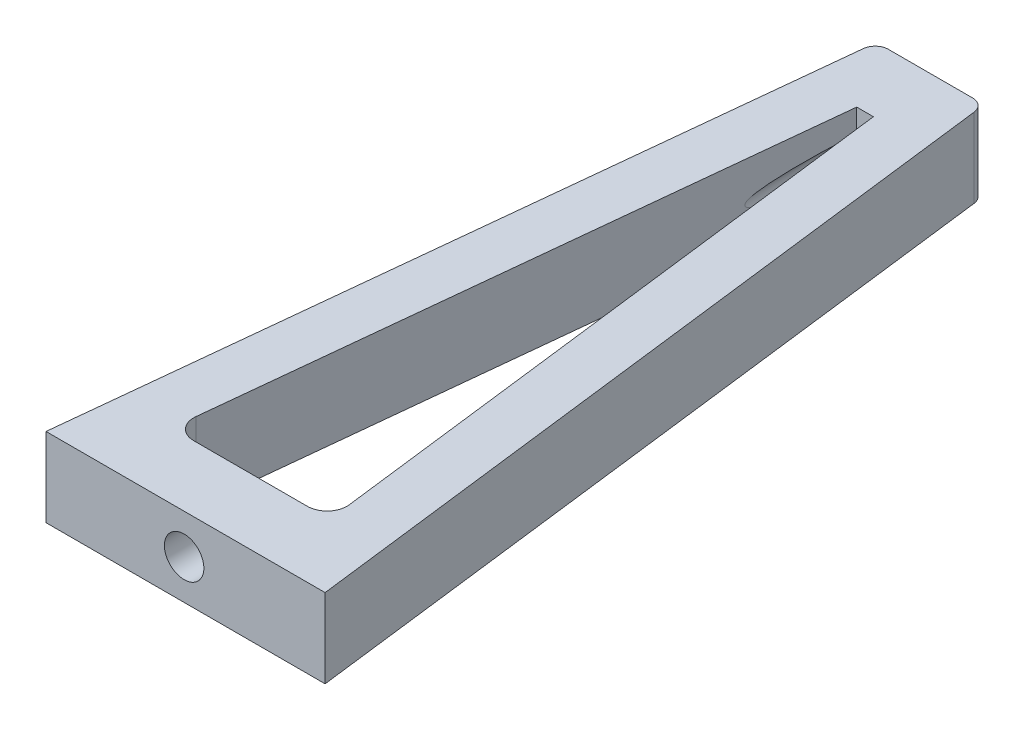
ISO-10303-21;
HEADER;
FILE_DESCRIPTION(('STEP AP214'),'2;1');
FILE_NAME('part.step','',(''),(''),'','','');
FILE_SCHEMA(('AUTOMOTIVE_DESIGN { 1 0 10303 214 1 1 1 1 }'));
ENDSEC;
DATA;
#1=APPLICATION_CONTEXT('core data for automotive mechanical design processes');
#2=APPLICATION_PROTOCOL_DEFINITION('international standard','automotive_design',2000,#1);
#3=PRODUCT_CONTEXT('',#1,'mechanical');
#4=PRODUCT('Part','Part','',(#3));
#5=PRODUCT_RELATED_PRODUCT_CATEGORY('part','',(#4));
#6=PRODUCT_DEFINITION_FORMATION('','',#4);
#7=PRODUCT_DEFINITION_CONTEXT('part definition',#1,'design');
#8=PRODUCT_DEFINITION('design','',#6,#7);
#9=PRODUCT_DEFINITION_SHAPE('','',#8);
#10=(LENGTH_UNIT() NAMED_UNIT(*) SI_UNIT(.MILLI.,.METRE.));
#11=(NAMED_UNIT(*) PLANE_ANGLE_UNIT() SI_UNIT($,.RADIAN.));
#12=(NAMED_UNIT(*) SI_UNIT($,.STERADIAN.) SOLID_ANGLE_UNIT());
#13=UNCERTAINTY_MEASURE_WITH_UNIT(LENGTH_MEASURE(1.E-05),#10,'distance_accuracy_value','');
#14=(GEOMETRIC_REPRESENTATION_CONTEXT(3) GLOBAL_UNCERTAINTY_ASSIGNED_CONTEXT((#13)) GLOBAL_UNIT_ASSIGNED_CONTEXT((#10,
#11,#12)) REPRESENTATION_CONTEXT('',''));
#15=CARTESIAN_POINT('',(0.,0.,0.));
#16=DIRECTION('',(0.,0.,1.));
#17=DIRECTION('',(1.,0.,0.));
#18=AXIS2_PLACEMENT_3D('',#15,#16,#17);
#19=CARTESIAN_POINT('',(9.67471825234836,6.,-42.1036060842594));
#20=DIRECTION('',(0.,0.,1.));
#21=DIRECTION('',(1.,0.,0.));
#22=AXIS2_PLACEMENT_3D('',#19,#20,#21);
#23=PLANE('',#22);
#24=CARTESIAN_POINT('',(9.00538159110922,3.,-42.1036060842594));
#25=DIRECTION('',(0.,0.,1.));
#26=DIRECTION('',(1.,0.,0.));
#27=AXIS2_PLACEMENT_3D('',#24,#25,#26);
#28=CIRCLE('',#27,1.4);
#29=CARTESIAN_POINT('',(9.67471825234836,4.22962938884903,-42.1036060842594));
#30=VERTEX_POINT('',#29);
#31=CARTESIAN_POINT('',(8.40743513778158,4.26588310635417,-42.1036060842594));
#32=VERTEX_POINT('',#31);
#33=EDGE_CURVE('E49',#30,#32,#28,.T.);
#34=ORIENTED_EDGE('',*,*,#33,.F.);
#35=DIRECTION('',(0.,-1.,0.));
#36=VECTOR('',#35,1.);
#37=CARTESIAN_POINT('',(9.67471825234836,6.,-42.1036060842594));
#38=LINE('',#37,#36);
#39=CARTESIAN_POINT('',(9.67471825234836,6.,-42.1036060842594));
#40=VERTEX_POINT('',#39);
#41=EDGE_CURVE('E160',#40,#30,#38,.T.);
#42=ORIENTED_EDGE('',*,*,#41,.F.);
#43=DIRECTION('',(-1.,0.,0.));
#44=VECTOR('',#43,1.);
#45=CARTESIAN_POINT('',(9.67471825234836,6.,-42.1036060842594));
#46=LINE('',#45,#44);
#47=CARTESIAN_POINT('',(8.40743513778158,6.,-42.1036060842594));
#48=VERTEX_POINT('',#47);
#49=EDGE_CURVE('E302',#40,#48,#46,.T.);
#50=ORIENTED_EDGE('',*,*,#49,.T.);
#51=DIRECTION('',(0.,-1.,0.));
#52=VECTOR('',#51,1.);
#53=CARTESIAN_POINT('',(8.40743513778158,6.,-42.1036060842594));
#54=LINE('',#53,#52);
#55=EDGE_CURVE('E154',#48,#32,#54,.T.);
#56=ORIENTED_EDGE('',*,*,#55,.T.);
#57=EDGE_LOOP('',(#34,#42,#50,#56));
#58=FACE_BOUND('',#57,.T.);
#59=ADVANCED_FACE('F34',(#58),#23,.T.);
#60=CARTESIAN_POINT('',(12.2028935057736,6.,-46.1036060842595));
#61=DIRECTION('',(0.,-1.,0.));
#62=DIRECTION('',(0.,0.,-1.));
#63=AXIS2_PLACEMENT_3D('',#60,#61,#62);
#64=PLANE('',#63);
#65=CARTESIAN_POINT('',(12.2028935057736,6.,-46.1036060842595));
#66=DIRECTION('',(0.,1.,0.));
#67=DIRECTION('',(0.,0.,-1.));
#68=AXIS2_PLACEMENT_3D('',#65,#66,#67);
#69=CIRCLE('',#68,1.);
#70=CARTESIAN_POINT('',(13.195333016172,6.,-46.2263408315818));
#71=VERTEX_POINT('',#70);
#72=CARTESIAN_POINT('',(12.2028935057736,6.,-47.1036060842595));
#73=VERTEX_POINT('',#72);
#74=EDGE_CURVE('E167',#71,#73,#69,.T.);
#75=ORIENTED_EDGE('',*,*,#74,.T.);
#76=DIRECTION('',(-1.,0.,0.));
#77=VECTOR('',#76,1.);
#78=CARTESIAN_POINT('',(5.80786967644483,6.,-47.1036060842595));
#79=LINE('',#78,#77);
#80=CARTESIAN_POINT('',(5.80786967644483,6.,-47.1036060842595));
#81=VERTEX_POINT('',#80);
#82=EDGE_CURVE('E170',#73,#81,#79,.T.);
#83=ORIENTED_EDGE('',*,*,#82,.T.);
#84=CARTESIAN_POINT('',(5.80786967644483,6.,-46.1036060842595));
#85=DIRECTION('',(0.,1.,0.));
#86=DIRECTION('',(0.,0.,1.));
#87=AXIS2_PLACEMENT_3D('',#84,#85,#86);
#88=CIRCLE('',#87,1.);
#89=CARTESIAN_POINT('',(4.81325126755405,6.,-46.2072121685189));
#90=VERTEX_POINT('',#89);
#91=EDGE_CURVE('E173',#81,#90,#88,.T.);
#92=ORIENTED_EDGE('',*,*,#91,.T.);
#93=DIRECTION('',(-0.103606084259456,0.,0.994618408890778));
#94=VECTOR('',#93,1.);
#95=CARTESIAN_POINT('',(4.81325126755405,6.,-46.2072121685189));
#96=LINE('',#95,#94);
#97=CARTESIAN_POINT('',(-1.04166666666667,6.,10.));
#98=VERTEX_POINT('',#97);
#99=EDGE_CURVE('E175',#90,#98,#96,.T.);
#100=ORIENTED_EDGE('',*,*,#99,.T.);
#101=DIRECTION('',(1.,0.,0.));
#102=VECTOR('',#101,1.);
#103=CARTESIAN_POINT('',(20.1488305971527,6.,10.));
#104=LINE('',#103,#102);
#105=CARTESIAN_POINT('',(20.1488305971527,6.,10.));
#106=VERTEX_POINT('',#105);
#107=EDGE_CURVE('E177',#98,#106,#104,.T.);
#108=ORIENTED_EDGE('',*,*,#107,.T.);
#109=DIRECTION('',(-0.122734747322353,0.,-0.992439510398351));
#110=VECTOR('',#109,1.);
#111=CARTESIAN_POINT('',(13.195333016172,6.,-46.2263408315818));
#112=LINE('',#111,#110);
#113=EDGE_CURVE('E179',#106,#71,#112,.T.);
#114=ORIENTED_EDGE('',*,*,#113,.T.);
#115=EDGE_LOOP('',(#75,#83,#92,#100,#108,#114));
#116=FACE_BOUND('',#115,.T.);
#117=CARTESIAN_POINT('',(13.8030777410744,6.,3.5));
#118=DIRECTION('',(0.,1.,0.));
#119=DIRECTION('',(0.,0.,1.));
#120=AXIS2_PLACEMENT_3D('',#117,#118,#119);
#121=CIRCLE('',#120,1.5);
#122=CARTESIAN_POINT('',(13.8030777410744,6.,5.));
#123=VERTEX_POINT('',#122);
#124=CARTESIAN_POINT('',(15.291737006672,6.,3.31589787901646));
#125=VERTEX_POINT('',#124);
#126=EDGE_CURVE('E297',#123,#125,#121,.T.);
#127=ORIENTED_EDGE('',*,*,#126,.F.);
#128=DIRECTION('',(1.,0.,0.));
#129=VECTOR('',#128,1.);
#130=CARTESIAN_POINT('',(5.16517556800627,6.,5.));
#131=LINE('',#130,#129);
#132=CARTESIAN_POINT('',(5.16517556800627,6.,5.));
#133=VERTEX_POINT('',#132);
#134=EDGE_CURVE('E308',#133,#123,#131,.T.);
#135=ORIENTED_EDGE('',*,*,#134,.F.);
#136=CARTESIAN_POINT('',(5.16517556800626,6.,3.5));
#137=DIRECTION('',(0.,1.,0.));
#138=DIRECTION('',(0.,0.,1.));
#139=AXIS2_PLACEMENT_3D('',#136,#137,#138);
#140=CIRCLE('',#139,1.5);
#141=CARTESIAN_POINT('',(3.67324795467009,6.,3.3445908736108));
#142=VERTEX_POINT('',#141);
#143=EDGE_CURVE('E306',#142,#133,#140,.T.);
#144=ORIENTED_EDGE('',*,*,#143,.F.);
#145=DIRECTION('',(-0.103606084259456,0.,0.994618408890778));
#146=VECTOR('',#145,1.);
#147=CARTESIAN_POINT('',(8.40743513778158,6.,-42.1036060842594));
#148=LINE('',#147,#146);
#149=EDGE_CURVE('E304',#48,#142,#148,.T.);
#150=ORIENTED_EDGE('',*,*,#149,.F.);
#151=ORIENTED_EDGE('',*,*,#49,.F.);
#152=DIRECTION('',(-0.122734747322353,0.,-0.992439510398351));
#153=VECTOR('',#152,1.);
#154=CARTESIAN_POINT('',(9.67471825234836,6.,-42.1036060842594));
#155=LINE('',#154,#153);
#156=EDGE_CURVE('E299',#125,#40,#155,.T.);
#157=ORIENTED_EDGE('',*,*,#156,.F.);
#158=EDGE_LOOP('',(#127,#135,#144,#150,#151,#157));
#159=FACE_BOUND('',#158,.T.);
#160=ADVANCED_FACE('F233',(#116,#159),#64,.F.);
#161=CARTESIAN_POINT('',(12.2028935057736,0.,-46.1036060842595));
#162=DIRECTION('',(0.,-1.,0.));
#163=DIRECTION('',(0.,0.,-1.));
#164=AXIS2_PLACEMENT_3D('',#161,#162,#163);
#165=PLANE('',#164);
#166=CARTESIAN_POINT('',(12.2028935057736,0.,-46.1036060842595));
#167=DIRECTION('',(0.,1.,0.));
#168=DIRECTION('',(0.,0.,-1.));
#169=AXIS2_PLACEMENT_3D('',#166,#167,#168);
#170=CIRCLE('',#169,1.);
#171=CARTESIAN_POINT('',(13.195333016172,0.,-46.2263408315818));
#172=VERTEX_POINT('',#171);
#173=CARTESIAN_POINT('',(12.2028935057736,0.,-47.1036060842595));
#174=VERTEX_POINT('',#173);
#175=EDGE_CURVE('E166',#172,#174,#170,.T.);
#176=ORIENTED_EDGE('',*,*,#175,.F.);
#177=DIRECTION('',(-0.122734747322353,0.,-0.992439510398351));
#178=VECTOR('',#177,1.);
#179=CARTESIAN_POINT('',(13.195333016172,0.,-46.2263408315818));
#180=LINE('',#179,#178);
#181=CARTESIAN_POINT('',(20.1488305971527,0.,10.));
#182=VERTEX_POINT('',#181);
#183=EDGE_CURVE('E171',#182,#172,#180,.T.);
#184=ORIENTED_EDGE('',*,*,#183,.F.);
#185=DIRECTION('',(1.,0.,0.));
#186=VECTOR('',#185,1.);
#187=CARTESIAN_POINT('',(20.1488305971527,0.,10.));
#188=LINE('',#187,#186);
#189=CARTESIAN_POINT('',(-1.04166666666667,0.,10.));
#190=VERTEX_POINT('',#189);
#191=EDGE_CURVE('E190',#190,#182,#188,.T.);
#192=ORIENTED_EDGE('',*,*,#191,.F.);
#193=DIRECTION('',(-0.103606084259456,0.,0.994618408890778));
#194=VECTOR('',#193,1.);
#195=CARTESIAN_POINT('',(4.81325126755405,0.,-46.2072121685189));
#196=LINE('',#195,#194);
#197=CARTESIAN_POINT('',(4.81325126755405,0.,-46.2072121685189));
#198=VERTEX_POINT('',#197);
#199=EDGE_CURVE('E188',#198,#190,#196,.T.);
#200=ORIENTED_EDGE('',*,*,#199,.F.);
#201=CARTESIAN_POINT('',(5.80786967644483,0.,-46.1036060842595));
#202=DIRECTION('',(0.,1.,0.));
#203=DIRECTION('',(0.,0.,1.));
#204=AXIS2_PLACEMENT_3D('',#201,#202,#203);
#205=CIRCLE('',#204,1.);
#206=CARTESIAN_POINT('',(5.80786967644483,0.,-47.1036060842595));
#207=VERTEX_POINT('',#206);
#208=EDGE_CURVE('E186',#207,#198,#205,.T.);
#209=ORIENTED_EDGE('',*,*,#208,.F.);
#210=DIRECTION('',(-1.,0.,0.));
#211=VECTOR('',#210,1.);
#212=CARTESIAN_POINT('',(5.80786967644483,0.,-47.1036060842595));
#213=LINE('',#212,#211);
#214=EDGE_CURVE('E184',#174,#207,#213,.T.);
#215=ORIENTED_EDGE('',*,*,#214,.F.);
#216=EDGE_LOOP('',(#176,#184,#192,#200,#209,#215));
#217=FACE_BOUND('',#216,.T.);
#218=DIRECTION('',(1.,0.,0.));
#219=VECTOR('',#218,1.);
#220=CARTESIAN_POINT('',(5.16517556800627,0.,5.));
#221=LINE('',#220,#219);
#222=CARTESIAN_POINT('',(5.16517556800627,0.,5.));
#223=VERTEX_POINT('',#222);
#224=CARTESIAN_POINT('',(13.8030777410744,0.,5.));
#225=VERTEX_POINT('',#224);
#226=EDGE_CURVE('E300',#223,#225,#221,.T.);
#227=ORIENTED_EDGE('',*,*,#226,.T.);
#228=CARTESIAN_POINT('',(13.8030777410744,0.,3.5));
#229=DIRECTION('',(0.,1.,0.));
#230=DIRECTION('',(0.,0.,1.));
#231=AXIS2_PLACEMENT_3D('',#228,#229,#230);
#232=CIRCLE('',#231,1.5);
#233=CARTESIAN_POINT('',(15.291737006672,0.,3.31589787901646));
#234=VERTEX_POINT('',#233);
#235=EDGE_CURVE('E296',#225,#234,#232,.T.);
#236=ORIENTED_EDGE('',*,*,#235,.T.);
#237=DIRECTION('',(-0.122734747322353,0.,-0.992439510398351));
#238=VECTOR('',#237,1.);
#239=CARTESIAN_POINT('',(9.67471825234836,0.,-42.1036060842594));
#240=LINE('',#239,#238);
#241=CARTESIAN_POINT('',(9.67471825234836,0.,-42.1036060842594));
#242=VERTEX_POINT('',#241);
#243=EDGE_CURVE('E313',#234,#242,#240,.T.);
#244=ORIENTED_EDGE('',*,*,#243,.T.);
#245=DIRECTION('',(-1.,0.,0.));
#246=VECTOR('',#245,1.);
#247=CARTESIAN_POINT('',(9.67471825234836,0.,-42.1036060842594));
#248=LINE('',#247,#246);
#249=CARTESIAN_POINT('',(8.40743513778158,0.,-42.1036060842594));
#250=VERTEX_POINT('',#249);
#251=EDGE_CURVE('E316',#242,#250,#248,.T.);
#252=ORIENTED_EDGE('',*,*,#251,.T.);
#253=DIRECTION('',(-0.103606084259456,0.,0.994618408890778));
#254=VECTOR('',#253,1.);
#255=CARTESIAN_POINT('',(8.40743513778158,0.,-42.1036060842594));
#256=LINE('',#255,#254);
#257=CARTESIAN_POINT('',(3.67324795467009,0.,3.3445908736108));
#258=VERTEX_POINT('',#257);
#259=EDGE_CURVE('E152',#250,#258,#256,.T.);
#260=ORIENTED_EDGE('',*,*,#259,.T.);
#261=CARTESIAN_POINT('',(5.16517556800626,0.,3.5));
#262=DIRECTION('',(0.,1.,0.));
#263=DIRECTION('',(0.,0.,1.));
#264=AXIS2_PLACEMENT_3D('',#261,#262,#263);
#265=CIRCLE('',#264,1.5);
#266=EDGE_CURVE('E319',#258,#223,#265,.T.);
#267=ORIENTED_EDGE('',*,*,#266,.T.);
#268=EDGE_LOOP('',(#227,#236,#244,#252,#260,#267));
#269=FACE_BOUND('',#268,.T.);
#270=ADVANCED_FACE('F218',(#217,#269),#165,.T.);
#271=CARTESIAN_POINT('',(12.2028935057736,6.,-46.1036060842595));
#272=DIRECTION('',(0.,-1.,0.));
#273=DIRECTION('',(0.,0.,-1.));
#274=AXIS2_PLACEMENT_3D('',#271,#272,#273);
#275=CYLINDRICAL_SURFACE('',#274,1.);
#276=ORIENTED_EDGE('',*,*,#175,.T.);
#277=DIRECTION('',(0.,-1.,0.));
#278=VECTOR('',#277,1.);
#279=CARTESIAN_POINT('',(12.2028935057736,6.,-47.1036060842595));
#280=LINE('',#279,#278);
#281=EDGE_CURVE('E43',#73,#174,#280,.T.);
#282=ORIENTED_EDGE('',*,*,#281,.F.);
#283=ORIENTED_EDGE('',*,*,#74,.F.);
#284=DIRECTION('',(0.,-1.,0.));
#285=VECTOR('',#284,1.);
#286=CARTESIAN_POINT('',(13.195333016172,6.,-46.2263408315818));
#287=LINE('',#286,#285);
#288=EDGE_CURVE('E181',#71,#172,#287,.T.);
#289=ORIENTED_EDGE('',*,*,#288,.T.);
#290=EDGE_LOOP('',(#276,#282,#283,#289));
#291=FACE_BOUND('',#290,.T.);
#292=ADVANCED_FACE('F36',(#291),#275,.T.);
#293=CARTESIAN_POINT('',(5.80786967644483,6.,-47.1036060842595));
#294=DIRECTION('',(0.,0.,1.));
#295=DIRECTION('',(1.,0.,0.));
#296=AXIS2_PLACEMENT_3D('',#293,#294,#295);
#297=PLANE('',#296);
#298=CARTESIAN_POINT('',(9.00538159110922,3.,-47.1036060842595));
#299=DIRECTION('',(0.,0.,-1.));
#300=DIRECTION('',(-1.,0.,0.));
#301=AXIS2_PLACEMENT_3D('',#298,#299,#300);
#302=CIRCLE('',#301,1.4);
#303=CARTESIAN_POINT('',(7.60538159110922,3.,-47.1036060842595));
#304=VERTEX_POINT('',#303);
#305=EDGE_CURVE('E148',#304,#304,#302,.T.);
#306=ORIENTED_EDGE('',*,*,#305,.F.);
#307=EDGE_LOOP('',(#306));
#308=FACE_BOUND('',#307,.T.);
#309=ORIENTED_EDGE('',*,*,#214,.T.);
#310=DIRECTION('',(0.,-1.,0.));
#311=VECTOR('',#310,1.);
#312=CARTESIAN_POINT('',(5.80786967644483,6.,-47.1036060842595));
#313=LINE('',#312,#311);
#314=EDGE_CURVE('E204',#81,#207,#313,.T.);
#315=ORIENTED_EDGE('',*,*,#314,.F.);
#316=ORIENTED_EDGE('',*,*,#82,.F.);
#317=ORIENTED_EDGE('',*,*,#281,.T.);
#318=EDGE_LOOP('',(#309,#315,#316,#317));
#319=FACE_BOUND('',#318,.T.);
#320=ADVANCED_FACE('F210',(#308,#319),#297,.F.);
#321=CARTESIAN_POINT('',(5.80786967644483,6.,-46.1036060842595));
#322=DIRECTION('',(0.,-1.,0.));
#323=DIRECTION('',(0.,0.,-1.));
#324=AXIS2_PLACEMENT_3D('',#321,#322,#323);
#325=CYLINDRICAL_SURFACE('',#324,1.);
#326=ORIENTED_EDGE('',*,*,#208,.T.);
#327=DIRECTION('',(0.,-1.,0.));
#328=VECTOR('',#327,1.);
#329=CARTESIAN_POINT('',(4.81325126755405,6.,-46.2072121685189));
#330=LINE('',#329,#328);
#331=EDGE_CURVE('E201',#90,#198,#330,.T.);
#332=ORIENTED_EDGE('',*,*,#331,.F.);
#333=ORIENTED_EDGE('',*,*,#91,.F.);
#334=ORIENTED_EDGE('',*,*,#314,.T.);
#335=EDGE_LOOP('',(#326,#332,#333,#334));
#336=FACE_BOUND('',#335,.T.);
#337=ADVANCED_FACE('F225',(#336),#325,.T.);
#338=CARTESIAN_POINT('',(4.81325126755405,6.,-46.2072121685189));
#339=DIRECTION('',(0.994618408890778,0.,0.103606084259456));
#340=DIRECTION('',(0.103606084259456,0.,-0.994618408890778));
#341=AXIS2_PLACEMENT_3D('',#338,#339,#340);
#342=PLANE('',#341);
#343=ORIENTED_EDGE('',*,*,#199,.T.);
#344=DIRECTION('',(0.,-1.,0.));
#345=VECTOR('',#344,1.);
#346=CARTESIAN_POINT('',(-1.04166666666667,6.,10.));
#347=LINE('',#346,#345);
#348=EDGE_CURVE('E198',#98,#190,#347,.T.);
#349=ORIENTED_EDGE('',*,*,#348,.F.);
#350=ORIENTED_EDGE('',*,*,#99,.F.);
#351=ORIENTED_EDGE('',*,*,#331,.T.);
#352=EDGE_LOOP('',(#343,#349,#350,#351));
#353=FACE_BOUND('',#352,.T.);
#354=ADVANCED_FACE('F229',(#353),#342,.F.);
#355=CARTESIAN_POINT('',(20.1488305971527,6.,10.));
#356=DIRECTION('',(0.,0.,-1.));
#357=DIRECTION('',(-1.,0.,0.));
#358=AXIS2_PLACEMENT_3D('',#355,#356,#357);
#359=PLANE('',#358);
#360=CARTESIAN_POINT('',(9.44521131199942,3.,10.));
#361=DIRECTION('',(0.,0.,-1.));
#362=DIRECTION('',(-1.,0.,0.));
#363=AXIS2_PLACEMENT_3D('',#360,#361,#362);
#364=CIRCLE('',#363,1.5);
#365=CARTESIAN_POINT('',(7.94521131199943,3.,10.));
#366=VERTEX_POINT('',#365);
#367=EDGE_CURVE('E289',#366,#366,#364,.F.);
#368=ORIENTED_EDGE('',*,*,#367,.F.);
#369=EDGE_LOOP('',(#368));
#370=FACE_BOUND('',#369,.T.);
#371=ORIENTED_EDGE('',*,*,#191,.T.);
#372=DIRECTION('',(0.,-1.,0.));
#373=VECTOR('',#372,1.);
#374=CARTESIAN_POINT('',(20.1488305971527,6.,10.));
#375=LINE('',#374,#373);
#376=EDGE_CURVE('E195',#106,#182,#375,.T.);
#377=ORIENTED_EDGE('',*,*,#376,.F.);
#378=ORIENTED_EDGE('',*,*,#107,.F.);
#379=ORIENTED_EDGE('',*,*,#348,.T.);
#380=EDGE_LOOP('',(#371,#377,#378,#379));
#381=FACE_BOUND('',#380,.T.);
#382=ADVANCED_FACE('F240',(#370,#381),#359,.F.);
#383=CARTESIAN_POINT('',(13.195333016172,6.,-46.2263408315818));
#384=DIRECTION('',(-0.992439510398351,0.,0.122734747322353));
#385=DIRECTION('',(0.122734747322353,0.,0.992439510398351));
#386=AXIS2_PLACEMENT_3D('',#383,#384,#385);
#387=PLANE('',#386);
#388=ORIENTED_EDGE('',*,*,#183,.T.);
#389=ORIENTED_EDGE('',*,*,#288,.F.);
#390=ORIENTED_EDGE('',*,*,#113,.F.);
#391=ORIENTED_EDGE('',*,*,#376,.T.);
#392=EDGE_LOOP('',(#388,#389,#390,#391));
#393=FACE_BOUND('',#392,.T.);
#394=ADVANCED_FACE('F238',(#393),#387,.F.);
#395=CARTESIAN_POINT('',(13.8030777410744,6.,3.5));
#396=DIRECTION('',(0.,-1.,0.));
#397=DIRECTION('',(0.,0.,-1.));
#398=AXIS2_PLACEMENT_3D('',#395,#396,#397);
#399=CYLINDRICAL_SURFACE('',#398,1.5);
#400=ORIENTED_EDGE('',*,*,#235,.F.);
#401=DIRECTION('',(0.,-1.,0.));
#402=VECTOR('',#401,1.);
#403=CARTESIAN_POINT('',(13.8030777410744,6.,5.));
#404=LINE('',#403,#402);
#405=EDGE_CURVE('E310',#123,#225,#404,.T.);
#406=ORIENTED_EDGE('',*,*,#405,.F.);
#407=ORIENTED_EDGE('',*,*,#126,.T.);
#408=DIRECTION('',(0.,-1.,0.));
#409=VECTOR('',#408,1.);
#410=CARTESIAN_POINT('',(15.291737006672,6.,3.31589787901646));
#411=LINE('',#410,#409);
#412=EDGE_CURVE('E163',#125,#234,#411,.T.);
#413=ORIENTED_EDGE('',*,*,#412,.T.);
#414=EDGE_LOOP('',(#400,#406,#407,#413));
#415=FACE_BOUND('',#414,.T.);
#416=ADVANCED_FACE('F248',(#415),#399,.F.);
#417=CARTESIAN_POINT('',(9.67471825234836,6.,-42.1036060842594));
#418=DIRECTION('',(-0.992439510398351,0.,0.122734747322353));
#419=DIRECTION('',(0.122734747322353,0.,0.992439510398351));
#420=AXIS2_PLACEMENT_3D('',#417,#418,#419);
#421=PLANE('',#420);
#422=CARTESIAN_POINT('',(9.00538159110922,3.,-47.5158969217284));
#423=DIRECTION('',(-0.992439510398351,0.,0.122734747322353));
#424=DIRECTION('',(-0.122734747322353,0.,-0.992439510398351));
#425=AXIS2_PLACEMENT_3D('',#422,#423,#424);
#426=ELLIPSE('',#425,11.406712691745,1.4);
#427=CARTESIAN_POINT('',(9.67471825234836,1.77037061115097,-42.1036060842594));
#428=VERTEX_POINT('',#427);
#429=EDGE_CURVE('E294',#428,#30,#426,.T.);
#430=ORIENTED_EDGE('',*,*,#429,.F.);
#431=EDGE_CURVE('E147',#428,#242,#38,.T.);
#432=ORIENTED_EDGE('',*,*,#431,.T.);
#433=ORIENTED_EDGE('',*,*,#243,.F.);
#434=ORIENTED_EDGE('',*,*,#412,.F.);
#435=ORIENTED_EDGE('',*,*,#156,.T.);
#436=ORIENTED_EDGE('',*,*,#41,.T.);
#437=EDGE_LOOP('',(#430,#432,#433,#434,#435,#436));
#438=FACE_BOUND('',#437,.T.);
#439=ADVANCED_FACE('F262',(#438),#421,.T.);
#440=CARTESIAN_POINT('',(8.40743513778158,1.73411689364583,-42.1036060842594));
#441=VERTEX_POINT('',#440);
#442=EDGE_CURVE('E135',#441,#428,#28,.T.);
#443=ORIENTED_EDGE('',*,*,#442,.F.);
#444=EDGE_CURVE('E145',#441,#250,#54,.T.);
#445=ORIENTED_EDGE('',*,*,#444,.T.);
#446=ORIENTED_EDGE('',*,*,#251,.F.);
#447=ORIENTED_EDGE('',*,*,#431,.F.);
#448=EDGE_LOOP('',(#443,#445,#446,#447));
#449=FACE_BOUND('',#448,.T.);
#450=ADVANCED_FACE('F143',(#449),#23,.T.);
#451=CARTESIAN_POINT('',(8.40743513778158,6.,-42.1036060842594));
#452=DIRECTION('',(0.994618408890778,0.,0.103606084259456));
#453=DIRECTION('',(0.103606084259456,0.,-0.994618408890778));
#454=AXIS2_PLACEMENT_3D('',#451,#452,#453);
#455=PLANE('',#454);
#456=CARTESIAN_POINT('',(9.00538159110922,3.,-47.8438920362048));
#457=DIRECTION('',(0.994618408890778,0.,0.103606084259456));
#458=DIRECTION('',(0.103606084259456,0.,-0.994618408890778));
#459=AXIS2_PLACEMENT_3D('',#456,#457,#458);
#460=ELLIPSE('',#459,13.5127199334553,1.4);
#461=EDGE_CURVE('E11',#32,#441,#460,.T.);
#462=ORIENTED_EDGE('',*,*,#461,.F.);
#463=ORIENTED_EDGE('',*,*,#55,.F.);
#464=ORIENTED_EDGE('',*,*,#149,.T.);
#465=DIRECTION('',(0.,-1.,0.));
#466=VECTOR('',#465,1.);
#467=CARTESIAN_POINT('',(3.67324795467009,6.,3.3445908736108));
#468=LINE('',#467,#466);
#469=EDGE_CURVE('E155',#142,#258,#468,.T.);
#470=ORIENTED_EDGE('',*,*,#469,.T.);
#471=ORIENTED_EDGE('',*,*,#259,.F.);
#472=ORIENTED_EDGE('',*,*,#444,.F.);
#473=EDGE_LOOP('',(#462,#463,#464,#470,#471,#472));
#474=FACE_BOUND('',#473,.T.);
#475=ADVANCED_FACE('F150',(#474),#455,.T.);
#476=CARTESIAN_POINT('',(5.16517556800626,6.,3.5));
#477=DIRECTION('',(0.,-1.,0.));
#478=DIRECTION('',(0.,0.,-1.));
#479=AXIS2_PLACEMENT_3D('',#476,#477,#478);
#480=CYLINDRICAL_SURFACE('',#479,1.5);
#481=ORIENTED_EDGE('',*,*,#266,.F.);
#482=ORIENTED_EDGE('',*,*,#469,.F.);
#483=ORIENTED_EDGE('',*,*,#143,.T.);
#484=DIRECTION('',(0.,-1.,0.));
#485=VECTOR('',#484,1.);
#486=CARTESIAN_POINT('',(5.16517556800627,6.,5.));
#487=LINE('',#486,#485);
#488=EDGE_CURVE('E57',#133,#223,#487,.T.);
#489=ORIENTED_EDGE('',*,*,#488,.T.);
#490=EDGE_LOOP('',(#481,#482,#483,#489));
#491=FACE_BOUND('',#490,.T.);
#492=ADVANCED_FACE('F267',(#491),#480,.F.);
#493=CARTESIAN_POINT('',(5.16517556800627,6.,5.));
#494=DIRECTION('',(0.,0.,-1.));
#495=DIRECTION('',(-1.,0.,0.));
#496=AXIS2_PLACEMENT_3D('',#493,#494,#495);
#497=PLANE('',#496);
#498=CARTESIAN_POINT('',(9.44521131199942,3.,5.));
#499=DIRECTION('',(0.,0.,-1.));
#500=DIRECTION('',(-1.,0.,0.));
#501=AXIS2_PLACEMENT_3D('',#498,#499,#500);
#502=CIRCLE('',#501,1.5);
#503=CARTESIAN_POINT('',(7.94521131199943,3.,5.00000000000001));
#504=VERTEX_POINT('',#503);
#505=EDGE_CURVE('E38',#504,#504,#502,.F.);
#506=ORIENTED_EDGE('',*,*,#505,.T.);
#507=EDGE_LOOP('',(#506));
#508=FACE_BOUND('',#507,.T.);
#509=ORIENTED_EDGE('',*,*,#226,.F.);
#510=ORIENTED_EDGE('',*,*,#488,.F.);
#511=ORIENTED_EDGE('',*,*,#134,.T.);
#512=ORIENTED_EDGE('',*,*,#405,.T.);
#513=EDGE_LOOP('',(#509,#510,#511,#512));
#514=FACE_BOUND('',#513,.T.);
#515=ADVANCED_FACE('F330',(#508,#514),#497,.T.);
#516=CARTESIAN_POINT('',(9.00538159110922,3.,-27.1036060842595));
#517=DIRECTION('',(0.,0.,-1.));
#518=DIRECTION('',(-1.,0.,0.));
#519=AXIS2_PLACEMENT_3D('',#516,#517,#518);
#520=CYLINDRICAL_SURFACE('',#519,1.4);
#521=ORIENTED_EDGE('',*,*,#429,.T.);
#522=ORIENTED_EDGE('',*,*,#33,.T.);
#523=ORIENTED_EDGE('',*,*,#461,.T.);
#524=ORIENTED_EDGE('',*,*,#442,.T.);
#525=EDGE_LOOP('',(#521,#522,#523,#524));
#526=FACE_BOUND('',#525,.T.);
#527=ORIENTED_EDGE('',*,*,#305,.T.);
#528=EDGE_LOOP('',(#527));
#529=FACE_BOUND('',#528,.T.);
#530=ADVANCED_FACE('F133',(#526,#529),#520,.F.);
#531=CARTESIAN_POINT('',(9.44521131199942,3.,200.));
#532=DIRECTION('',(0.,0.,-1.));
#533=DIRECTION('',(-1.,0.,0.));
#534=AXIS2_PLACEMENT_3D('',#531,#532,#533);
#535=CYLINDRICAL_SURFACE('',#534,1.5);
#536=ORIENTED_EDGE('',*,*,#505,.F.);
#537=EDGE_LOOP('',(#536));
#538=FACE_BOUND('',#537,.T.);
#539=ORIENTED_EDGE('',*,*,#367,.T.);
#540=EDGE_LOOP('',(#539));
#541=FACE_BOUND('',#540,.T.);
#542=ADVANCED_FACE('F345',(#538,#541),#535,.F.);
#543=CLOSED_SHELL('',(#59,#160,#270,#292,#320,#337,#354,#382,#394,#416,#439,#450,#475,#492,#515,
#530,#542));
#544=MANIFOLD_SOLID_BREP('B2',#543);
#545=ADVANCED_BREP_SHAPE_REPRESENTATION('',(#18,#544),#14);
#546=SHAPE_DEFINITION_REPRESENTATION(#9,#545);
ENDSEC;
END-ISO-10303-21;
